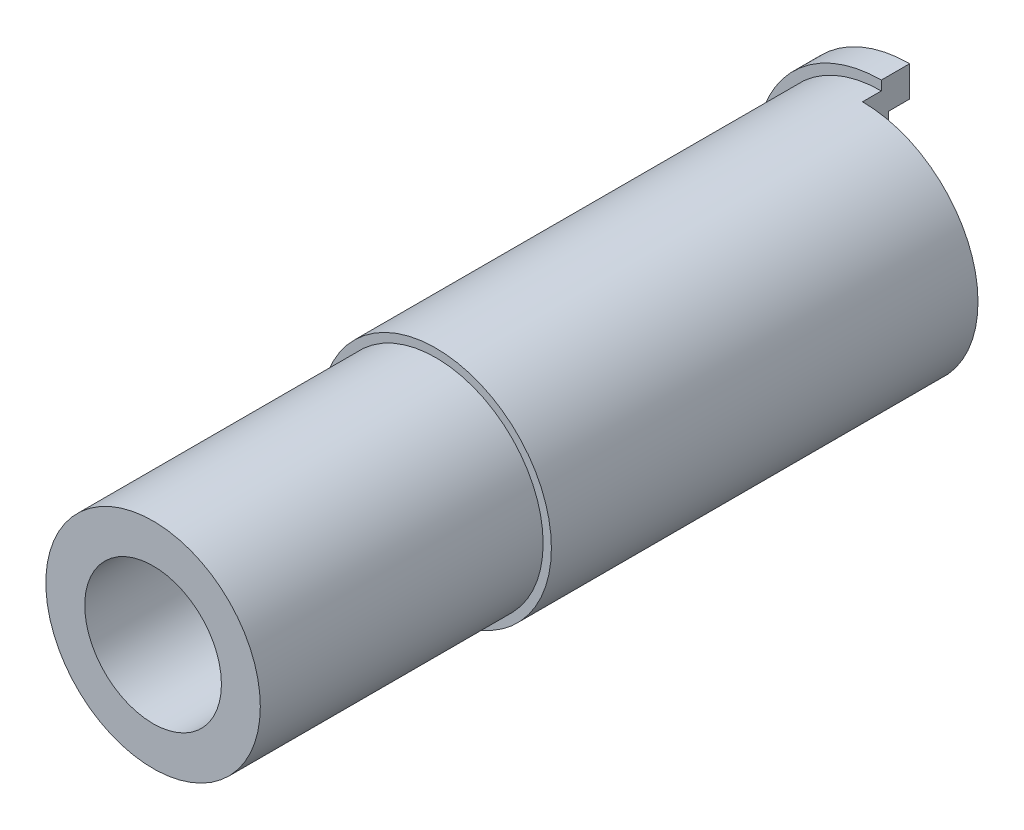
ISO-10303-21;
HEADER;
FILE_DESCRIPTION(('STEP AP214'),'2;1');
FILE_NAME('part.step','',(''),(''),'','','');
FILE_SCHEMA(('AUTOMOTIVE_DESIGN { 1 0 10303 214 1 1 1 1 }'));
ENDSEC;
DATA;
#1=APPLICATION_CONTEXT('core data for automotive mechanical design processes');
#2=APPLICATION_PROTOCOL_DEFINITION('international standard','automotive_design',2000,#1);
#3=PRODUCT_CONTEXT('',#1,'mechanical');
#4=PRODUCT('Part','Part','',(#3));
#5=PRODUCT_RELATED_PRODUCT_CATEGORY('part','',(#4));
#6=PRODUCT_DEFINITION_FORMATION('','',#4);
#7=PRODUCT_DEFINITION_CONTEXT('part definition',#1,'design');
#8=PRODUCT_DEFINITION('design','',#6,#7);
#9=PRODUCT_DEFINITION_SHAPE('','',#8);
#10=(LENGTH_UNIT() NAMED_UNIT(*) SI_UNIT(.MILLI.,.METRE.));
#11=(NAMED_UNIT(*) PLANE_ANGLE_UNIT() SI_UNIT($,.RADIAN.));
#12=(NAMED_UNIT(*) SI_UNIT($,.STERADIAN.) SOLID_ANGLE_UNIT());
#13=UNCERTAINTY_MEASURE_WITH_UNIT(LENGTH_MEASURE(1.E-05),#10,'distance_accuracy_value','');
#14=(GEOMETRIC_REPRESENTATION_CONTEXT(3) GLOBAL_UNCERTAINTY_ASSIGNED_CONTEXT((#13)) GLOBAL_UNIT_ASSIGNED_CONTEXT((#10,
#11,#12)) REPRESENTATION_CONTEXT('',''));
#15=CARTESIAN_POINT('',(0.,0.,0.));
#16=DIRECTION('',(0.,0.,1.));
#17=DIRECTION('',(1.,0.,0.));
#18=AXIS2_PLACEMENT_3D('',#15,#16,#17);
#19=CARTESIAN_POINT('',(0.,0.,12.));
#20=DIRECTION('',(0.,0.,-1.));
#21=DIRECTION('',(-1.,0.,0.));
#22=AXIS2_PLACEMENT_3D('',#19,#20,#21);
#23=CYLINDRICAL_SURFACE('',#22,2.9);
#24=DIRECTION('',(0.,0.,-1.));
#25=VECTOR('',#24,1.);
#26=CARTESIAN_POINT('',(0.,2.9,12.));
#27=LINE('',#26,#25);
#28=CARTESIAN_POINT('',(0.,2.9,-18.1));
#29=VERTEX_POINT('',#28);
#30=CARTESIAN_POINT('',(0.,2.9,-19.2));
#31=VERTEX_POINT('',#30);
#32=EDGE_CURVE('E123',#29,#31,#27,.T.);
#33=ORIENTED_EDGE('',*,*,#32,.F.);
#34=CARTESIAN_POINT('',(0.,0.,-18.1));
#35=DIRECTION('',(0.,0.,1.));
#36=DIRECTION('',(1.,0.,0.));
#37=AXIS2_PLACEMENT_3D('',#34,#35,#36);
#38=CIRCLE('',#37,2.9);
#39=CARTESIAN_POINT('',(0.,-2.9,-18.1));
#40=VERTEX_POINT('',#39);
#41=EDGE_CURVE('E55',#40,#29,#38,.T.);
#42=ORIENTED_EDGE('',*,*,#41,.F.);
#43=DIRECTION('',(0.,0.,-1.));
#44=VECTOR('',#43,1.);
#45=CARTESIAN_POINT('',(0.,-2.9,12.));
#46=LINE('',#45,#44);
#47=CARTESIAN_POINT('',(0.,-2.9,-19.2));
#48=VERTEX_POINT('',#47);
#49=EDGE_CURVE('E121',#48,#40,#46,.F.);
#50=ORIENTED_EDGE('',*,*,#49,.F.);
#51=CARTESIAN_POINT('',(0.,0.,-19.2));
#52=DIRECTION('',(0.,0.,1.));
#53=DIRECTION('',(1.,0.,0.));
#54=AXIS2_PLACEMENT_3D('',#51,#52,#53);
#55=CIRCLE('',#54,2.9);
#56=EDGE_CURVE('E132',#31,#48,#55,.T.);
#57=ORIENTED_EDGE('',*,*,#56,.F.);
#58=EDGE_LOOP('',(#33,#42,#50,#57));
#59=FACE_BOUND('',#58,.T.);
#60=CARTESIAN_POINT('',(0.,0.,12.));
#61=DIRECTION('',(0.,0.,1.));
#62=DIRECTION('',(1.,0.,0.));
#63=AXIS2_PLACEMENT_3D('',#60,#61,#62);
#64=CIRCLE('',#63,2.9);
#65=CARTESIAN_POINT('',(2.9,0.,12.));
#66=VERTEX_POINT('',#65);
#67=EDGE_CURVE('E138',#66,#66,#64,.T.);
#68=ORIENTED_EDGE('',*,*,#67,.T.);
#69=EDGE_LOOP('',(#68));
#70=FACE_BOUND('',#69,.T.);
#71=ADVANCED_FACE('F34',(#59,#70),#23,.F.);
#72=CARTESIAN_POINT('',(0.,0.,12.));
#73=DIRECTION('',(0.,0.,-1.));
#74=DIRECTION('',(-1.,0.,0.));
#75=AXIS2_PLACEMENT_3D('',#72,#73,#74);
#76=CYLINDRICAL_SURFACE('',#75,4.55);
#77=CARTESIAN_POINT('',(0.,0.,12.));
#78=DIRECTION('',(0.,0.,1.));
#79=DIRECTION('',(1.,0.,0.));
#80=AXIS2_PLACEMENT_3D('',#77,#78,#79);
#81=CIRCLE('',#80,4.55);
#82=CARTESIAN_POINT('',(4.55,0.,12.));
#83=VERTEX_POINT('',#82);
#84=EDGE_CURVE('E141',#83,#83,#81,.T.);
#85=ORIENTED_EDGE('',*,*,#84,.F.);
#86=EDGE_LOOP('',(#85));
#87=FACE_BOUND('',#86,.T.);
#88=CARTESIAN_POINT('',(0.,0.,0.));
#89=DIRECTION('',(0.,0.,1.));
#90=DIRECTION('',(1.,0.,0.));
#91=AXIS2_PLACEMENT_3D('',#88,#89,#90);
#92=CIRCLE('',#91,4.55);
#93=CARTESIAN_POINT('',(4.55,0.,0.));
#94=VERTEX_POINT('',#93);
#95=EDGE_CURVE('E135',#94,#94,#92,.T.);
#96=ORIENTED_EDGE('',*,*,#95,.T.);
#97=EDGE_LOOP('',(#96));
#98=FACE_BOUND('',#97,.T.);
#99=ADVANCED_FACE('F202',(#87,#98),#76,.T.);
#100=CARTESIAN_POINT('',(0.,0.,12.));
#101=DIRECTION('',(0.,0.,1.));
#102=DIRECTION('',(1.,0.,0.));
#103=AXIS2_PLACEMENT_3D('',#100,#101,#102);
#104=PLANE('',#103);
#105=ORIENTED_EDGE('',*,*,#67,.F.);
#106=EDGE_LOOP('',(#105));
#107=FACE_BOUND('',#106,.T.);
#108=ORIENTED_EDGE('',*,*,#84,.T.);
#109=EDGE_LOOP('',(#108));
#110=FACE_BOUND('',#109,.T.);
#111=ADVANCED_FACE('F206',(#107,#110),#104,.T.);
#112=CARTESIAN_POINT('',(0.,0.,-19.2));
#113=DIRECTION('',(0.,0.,1.));
#114=DIRECTION('',(1.,0.,0.));
#115=AXIS2_PLACEMENT_3D('',#112,#113,#114);
#116=CYLINDRICAL_SURFACE('',#115,4.9);
#117=CARTESIAN_POINT('',(0.,0.,-18.9));
#118=DIRECTION('',(0.,0.,1.));
#119=DIRECTION('',(1.,0.,0.));
#120=AXIS2_PLACEMENT_3D('',#117,#118,#119);
#121=CIRCLE('',#120,4.9);
#122=CARTESIAN_POINT('',(0.,4.9,-18.9));
#123=VERTEX_POINT('',#122);
#124=CARTESIAN_POINT('',(0.,-4.9,-18.9));
#125=VERTEX_POINT('',#124);
#126=EDGE_CURVE('E102',#123,#125,#121,.T.);
#127=ORIENTED_EDGE('',*,*,#126,.T.);
#128=DIRECTION('',(0.,0.,1.));
#129=VECTOR('',#128,1.);
#130=CARTESIAN_POINT('',(0.,-4.9,-19.2));
#131=LINE('',#130,#129);
#132=CARTESIAN_POINT('',(0.,-4.9,-18.1));
#133=VERTEX_POINT('',#132);
#134=EDGE_CURVE('E115',#133,#125,#131,.F.);
#135=ORIENTED_EDGE('',*,*,#134,.F.);
#136=CARTESIAN_POINT('',(0.,0.,-18.1));
#137=DIRECTION('',(0.,0.,1.));
#138=DIRECTION('',(1.,0.,0.));
#139=AXIS2_PLACEMENT_3D('',#136,#137,#138);
#140=CIRCLE('',#139,4.9);
#141=CARTESIAN_POINT('',(0.,4.9,-18.1));
#142=VERTEX_POINT('',#141);
#143=EDGE_CURVE('E11',#142,#133,#140,.F.);
#144=ORIENTED_EDGE('',*,*,#143,.F.);
#145=DIRECTION('',(0.,0.,1.));
#146=VECTOR('',#145,1.);
#147=CARTESIAN_POINT('',(0.,4.9,-19.2));
#148=LINE('',#147,#146);
#149=EDGE_CURVE('E48',#123,#142,#148,.T.);
#150=ORIENTED_EDGE('',*,*,#149,.F.);
#151=EDGE_LOOP('',(#127,#135,#144,#150));
#152=FACE_BOUND('',#151,.T.);
#153=CARTESIAN_POINT('',(0.,0.,0.));
#154=DIRECTION('',(0.,0.,1.));
#155=DIRECTION('',(1.,0.,0.));
#156=AXIS2_PLACEMENT_3D('',#153,#154,#155);
#157=CIRCLE('',#156,4.9);
#158=CARTESIAN_POINT('',(4.9,0.,0.));
#159=VERTEX_POINT('',#158);
#160=EDGE_CURVE('E131',#159,#159,#157,.T.);
#161=ORIENTED_EDGE('',*,*,#160,.F.);
#162=EDGE_LOOP('',(#161));
#163=FACE_BOUND('',#162,.T.);
#164=ADVANCED_FACE('F112',(#152,#163),#116,.T.);
#165=CARTESIAN_POINT('',(0.,0.,-19.2));
#166=DIRECTION('',(0.,0.,1.));
#167=DIRECTION('',(1.,0.,0.));
#168=AXIS2_PLACEMENT_3D('',#165,#166,#167);
#169=PLANE('',#168);
#170=DIRECTION('',(0.,-1.,0.));
#171=VECTOR('',#170,1.);
#172=CARTESIAN_POINT('',(0.,0.,-19.2));
#173=LINE('',#172,#171);
#174=CARTESIAN_POINT('',(0.,-4.,-19.2));
#175=VERTEX_POINT('',#174);
#176=EDGE_CURVE('E144',#48,#175,#173,.T.);
#177=ORIENTED_EDGE('',*,*,#176,.T.);
#178=CARTESIAN_POINT('',(0.,0.,-19.2));
#179=DIRECTION('',(0.,0.,1.));
#180=DIRECTION('',(1.,0.,0.));
#181=AXIS2_PLACEMENT_3D('',#178,#179,#180);
#182=CIRCLE('',#181,4.);
#183=CARTESIAN_POINT('',(0.,4.,-19.2));
#184=VERTEX_POINT('',#183);
#185=EDGE_CURVE('E152',#184,#175,#182,.T.);
#186=ORIENTED_EDGE('',*,*,#185,.F.);
#187=EDGE_CURVE('E41',#184,#31,#173,.T.);
#188=ORIENTED_EDGE('',*,*,#187,.T.);
#189=ORIENTED_EDGE('',*,*,#56,.T.);
#190=EDGE_LOOP('',(#177,#186,#188,#189));
#191=FACE_BOUND('',#190,.T.);
#192=ADVANCED_FACE('F150',(#191),#169,.F.);
#193=CARTESIAN_POINT('',(0.,0.,0.));
#194=DIRECTION('',(0.,0.,1.));
#195=DIRECTION('',(1.,0.,0.));
#196=AXIS2_PLACEMENT_3D('',#193,#194,#195);
#197=PLANE('',#196);
#198=ORIENTED_EDGE('',*,*,#95,.F.);
#199=EDGE_LOOP('',(#198));
#200=FACE_BOUND('',#199,.T.);
#201=ORIENTED_EDGE('',*,*,#160,.T.);
#202=EDGE_LOOP('',(#201));
#203=FACE_BOUND('',#202,.T.);
#204=ADVANCED_FACE('F218',(#200,#203),#197,.T.);
#205=CARTESIAN_POINT('',(0.,-5.,-19.2));
#206=DIRECTION('',(-1.,0.,0.));
#207=DIRECTION('',(0.,0.,1.));
#208=AXIS2_PLACEMENT_3D('',#205,#206,#207);
#209=PLANE('',#208);
#210=ORIENTED_EDGE('',*,*,#187,.F.);
#211=DIRECTION('',(0.,0.,1.));
#212=VECTOR('',#211,1.);
#213=CARTESIAN_POINT('',(0.,4.,-20.1));
#214=LINE('',#213,#212);
#215=CARTESIAN_POINT('',(0.,4.,-20.1));
#216=VERTEX_POINT('',#215);
#217=EDGE_CURVE('E168',#216,#184,#214,.T.);
#218=ORIENTED_EDGE('',*,*,#217,.F.);
#219=DIRECTION('',(0.,-1.,0.));
#220=VECTOR('',#219,1.);
#221=CARTESIAN_POINT('',(0.,5.3,-20.1));
#222=LINE('',#221,#220);
#223=CARTESIAN_POINT('',(0.,5.3,-20.1));
#224=VERTEX_POINT('',#223);
#225=EDGE_CURVE('E170',#224,#216,#222,.T.);
#226=ORIENTED_EDGE('',*,*,#225,.F.);
#227=DIRECTION('',(0.,0.,-1.));
#228=VECTOR('',#227,1.);
#229=CARTESIAN_POINT('',(0.,5.3,-18.9));
#230=LINE('',#229,#228);
#231=CARTESIAN_POINT('',(0.,5.3,-18.9));
#232=VERTEX_POINT('',#231);
#233=EDGE_CURVE('E173',#232,#224,#230,.T.);
#234=ORIENTED_EDGE('',*,*,#233,.F.);
#235=DIRECTION('',(0.,1.,0.));
#236=VECTOR('',#235,1.);
#237=CARTESIAN_POINT('',(0.,4.9,-18.9));
#238=LINE('',#237,#236);
#239=EDGE_CURVE('E176',#123,#232,#238,.T.);
#240=ORIENTED_EDGE('',*,*,#239,.F.);
#241=ORIENTED_EDGE('',*,*,#149,.T.);
#242=DIRECTION('',(0.,1.,0.));
#243=VECTOR('',#242,1.);
#244=CARTESIAN_POINT('',(0.,-5.,-18.1));
#245=LINE('',#244,#243);
#246=EDGE_CURVE('E116',#29,#142,#245,.T.);
#247=ORIENTED_EDGE('',*,*,#246,.F.);
#248=ORIENTED_EDGE('',*,*,#32,.T.);
#249=EDGE_LOOP('',(#210,#218,#226,#234,#240,#241,#247,#248));
#250=FACE_BOUND('',#249,.T.);
#251=ADVANCED_FACE('F155',(#250),#209,.F.);
#252=ORIENTED_EDGE('',*,*,#49,.T.);
#253=EDGE_CURVE('E120',#133,#40,#245,.T.);
#254=ORIENTED_EDGE('',*,*,#253,.F.);
#255=ORIENTED_EDGE('',*,*,#134,.T.);
#256=DIRECTION('',(0.,-1.,0.));
#257=VECTOR('',#256,1.);
#258=CARTESIAN_POINT('',(0.,-4.9,-18.9));
#259=LINE('',#258,#257);
#260=CARTESIAN_POINT('',(0.,-5.3,-18.9));
#261=VERTEX_POINT('',#260);
#262=EDGE_CURVE('E98',#125,#261,#259,.T.);
#263=ORIENTED_EDGE('',*,*,#262,.T.);
#264=DIRECTION('',(0.,0.,-1.));
#265=VECTOR('',#264,1.);
#266=CARTESIAN_POINT('',(0.,-5.3,-18.9));
#267=LINE('',#266,#265);
#268=CARTESIAN_POINT('',(0.,-5.3,-20.1));
#269=VERTEX_POINT('',#268);
#270=EDGE_CURVE('E108',#261,#269,#267,.T.);
#271=ORIENTED_EDGE('',*,*,#270,.T.);
#272=DIRECTION('',(0.,1.,0.));
#273=VECTOR('',#272,1.);
#274=CARTESIAN_POINT('',(0.,-5.3,-20.1));
#275=LINE('',#274,#273);
#276=CARTESIAN_POINT('',(0.,-4.,-20.1));
#277=VERTEX_POINT('',#276);
#278=EDGE_CURVE('E180',#269,#277,#275,.T.);
#279=ORIENTED_EDGE('',*,*,#278,.T.);
#280=DIRECTION('',(0.,0.,1.));
#281=VECTOR('',#280,1.);
#282=CARTESIAN_POINT('',(0.,-4.,-20.1));
#283=LINE('',#282,#281);
#284=EDGE_CURVE('E178',#277,#175,#283,.T.);
#285=ORIENTED_EDGE('',*,*,#284,.T.);
#286=ORIENTED_EDGE('',*,*,#176,.F.);
#287=EDGE_LOOP('',(#252,#254,#255,#263,#271,#279,#285,#286));
#288=FACE_BOUND('',#287,.T.);
#289=ADVANCED_FACE('F119',(#288),#209,.F.);
#290=CARTESIAN_POINT('',(0.,-5.,-18.1));
#291=DIRECTION('',(0.,0.,1.));
#292=DIRECTION('',(1.,0.,0.));
#293=AXIS2_PLACEMENT_3D('',#290,#291,#292);
#294=PLANE('',#293);
#295=ORIENTED_EDGE('',*,*,#41,.T.);
#296=ORIENTED_EDGE('',*,*,#246,.T.);
#297=ORIENTED_EDGE('',*,*,#143,.T.);
#298=ORIENTED_EDGE('',*,*,#253,.T.);
#299=EDGE_LOOP('',(#295,#296,#297,#298));
#300=FACE_BOUND('',#299,.T.);
#301=ADVANCED_FACE('F160',(#300),#294,.F.);
#302=CARTESIAN_POINT('',(0.,4.9,-18.9));
#303=DIRECTION('',(0.,0.,1.));
#304=DIRECTION('',(1.,0.,0.));
#305=AXIS2_PLACEMENT_3D('',#302,#303,#304);
#306=PLANE('',#305);
#307=CARTESIAN_POINT('',(0.,0.,-18.9));
#308=DIRECTION('',(0.,0.,1.));
#309=DIRECTION('',(1.,0.,0.));
#310=AXIS2_PLACEMENT_3D('',#307,#308,#309);
#311=CIRCLE('',#310,5.3);
#312=EDGE_CURVE('E103',#232,#261,#311,.T.);
#313=ORIENTED_EDGE('',*,*,#312,.T.);
#314=ORIENTED_EDGE('',*,*,#262,.F.);
#315=ORIENTED_EDGE('',*,*,#126,.F.);
#316=ORIENTED_EDGE('',*,*,#239,.T.);
#317=EDGE_LOOP('',(#313,#314,#315,#316));
#318=FACE_BOUND('',#317,.T.);
#319=ADVANCED_FACE('F100',(#318),#306,.T.);
#320=CARTESIAN_POINT('',(0.,0.,0.));
#321=DIRECTION('',(0.,0.,1.));
#322=DIRECTION('',(1.,0.,0.));
#323=AXIS2_PLACEMENT_3D('',#320,#321,#322);
#324=CYLINDRICAL_SURFACE('',#323,5.3);
#325=CARTESIAN_POINT('',(0.,0.,-20.1));
#326=DIRECTION('',(0.,0.,1.));
#327=DIRECTION('',(1.,0.,0.));
#328=AXIS2_PLACEMENT_3D('',#325,#326,#327);
#329=CIRCLE('',#328,5.3);
#330=EDGE_CURVE('E163',#224,#269,#329,.T.);
#331=ORIENTED_EDGE('',*,*,#330,.T.);
#332=ORIENTED_EDGE('',*,*,#270,.F.);
#333=ORIENTED_EDGE('',*,*,#312,.F.);
#334=ORIENTED_EDGE('',*,*,#233,.T.);
#335=EDGE_LOOP('',(#331,#332,#333,#334));
#336=FACE_BOUND('',#335,.T.);
#337=ADVANCED_FACE('F192',(#336),#324,.T.);
#338=CARTESIAN_POINT('',(0.,5.3,-20.1));
#339=DIRECTION('',(0.,0.,-1.));
#340=DIRECTION('',(-1.,0.,0.));
#341=AXIS2_PLACEMENT_3D('',#338,#339,#340);
#342=PLANE('',#341);
#343=CARTESIAN_POINT('',(0.,0.,-20.1));
#344=DIRECTION('',(0.,0.,1.));
#345=DIRECTION('',(1.,0.,0.));
#346=AXIS2_PLACEMENT_3D('',#343,#344,#345);
#347=CIRCLE('',#346,4.);
#348=EDGE_CURVE('E165',#216,#277,#347,.T.);
#349=ORIENTED_EDGE('',*,*,#348,.T.);
#350=ORIENTED_EDGE('',*,*,#278,.F.);
#351=ORIENTED_EDGE('',*,*,#330,.F.);
#352=ORIENTED_EDGE('',*,*,#225,.T.);
#353=EDGE_LOOP('',(#349,#350,#351,#352));
#354=FACE_BOUND('',#353,.T.);
#355=ADVANCED_FACE('F187',(#354),#342,.T.);
#356=CARTESIAN_POINT('',(0.,0.,0.));
#357=DIRECTION('',(0.,0.,1.));
#358=DIRECTION('',(1.,0.,0.));
#359=AXIS2_PLACEMENT_3D('',#356,#357,#358);
#360=CYLINDRICAL_SURFACE('',#359,4.);
#361=ORIENTED_EDGE('',*,*,#217,.T.);
#362=ORIENTED_EDGE('',*,*,#185,.T.);
#363=ORIENTED_EDGE('',*,*,#284,.F.);
#364=ORIENTED_EDGE('',*,*,#348,.F.);
#365=EDGE_LOOP('',(#361,#362,#363,#364));
#366=FACE_BOUND('',#365,.T.);
#367=ADVANCED_FACE('F190',(#366),#360,.F.);
#368=CLOSED_SHELL('',(#71,#99,#111,#164,#192,#204,#251,#289,#301,#319,#337,#355,#367));
#369=MANIFOLD_SOLID_BREP('B2',#368);
#370=ADVANCED_BREP_SHAPE_REPRESENTATION('',(#18,#369),#14);
#371=SHAPE_DEFINITION_REPRESENTATION(#9,#370);
ENDSEC;
END-ISO-10303-21;
